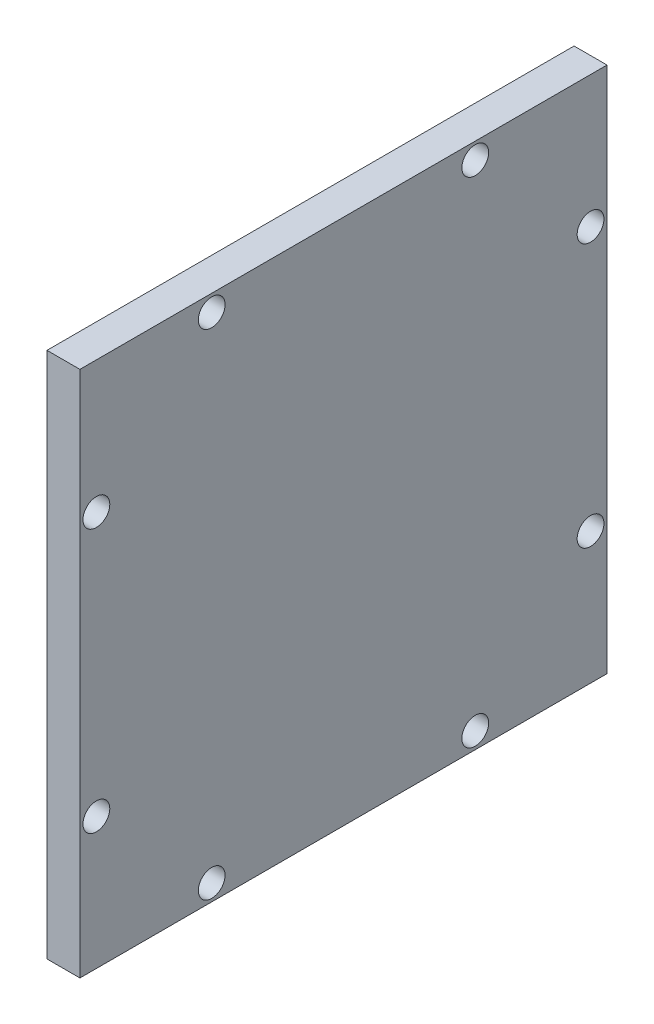
ISO-10303-21;
HEADER;
FILE_DESCRIPTION(('STEP AP214'),'2;1');
FILE_NAME('part.step','',(''),(''),'','','');
FILE_SCHEMA(('AUTOMOTIVE_DESIGN { 1 0 10303 214 1 1 1 1 }'));
ENDSEC;
DATA;
#1=APPLICATION_CONTEXT('core data for automotive mechanical design processes');
#2=APPLICATION_PROTOCOL_DEFINITION('international standard','automotive_design',2000,#1);
#3=PRODUCT_CONTEXT('',#1,'mechanical');
#4=PRODUCT('Part','Part','',(#3));
#5=PRODUCT_RELATED_PRODUCT_CATEGORY('part','',(#4));
#6=PRODUCT_DEFINITION_FORMATION('','',#4);
#7=PRODUCT_DEFINITION_CONTEXT('part definition',#1,'design');
#8=PRODUCT_DEFINITION('design','',#6,#7);
#9=PRODUCT_DEFINITION_SHAPE('','',#8);
#10=(LENGTH_UNIT() NAMED_UNIT(*) SI_UNIT(.MILLI.,.METRE.));
#11=(NAMED_UNIT(*) PLANE_ANGLE_UNIT() SI_UNIT($,.RADIAN.));
#12=(NAMED_UNIT(*) SI_UNIT($,.STERADIAN.) SOLID_ANGLE_UNIT());
#13=UNCERTAINTY_MEASURE_WITH_UNIT(LENGTH_MEASURE(1.E-05),#10,'distance_accuracy_value','');
#14=(GEOMETRIC_REPRESENTATION_CONTEXT(3) GLOBAL_UNCERTAINTY_ASSIGNED_CONTEXT((#13)) GLOBAL_UNIT_ASSIGNED_CONTEXT((#10,
#11,#12)) REPRESENTATION_CONTEXT('',''));
#15=CARTESIAN_POINT('',(0.,0.,0.));
#16=DIRECTION('',(0.,0.,1.));
#17=DIRECTION('',(1.,0.,0.));
#18=AXIS2_PLACEMENT_3D('',#15,#16,#17);
#19=CARTESIAN_POINT('',(3.,0.,0.));
#20=DIRECTION('',(0.,0.,-1.));
#21=DIRECTION('',(-1.,0.,0.));
#22=AXIS2_PLACEMENT_3D('',#19,#20,#21);
#23=PLANE('',#22);
#24=DIRECTION('',(0.,-1.,0.));
#25=VECTOR('',#24,1.);
#26=CARTESIAN_POINT('',(0.,0.,0.));
#27=LINE('',#26,#25);
#28=CARTESIAN_POINT('',(0.,48.,0.));
#29=VERTEX_POINT('',#28);
#30=CARTESIAN_POINT('',(0.,0.,0.));
#31=VERTEX_POINT('',#30);
#32=EDGE_CURVE('E107',#29,#31,#27,.T.);
#33=ORIENTED_EDGE('',*,*,#32,.T.);
#34=DIRECTION('',(-1.,0.,0.));
#35=VECTOR('',#34,1.);
#36=CARTESIAN_POINT('',(3.,0.,0.));
#37=LINE('',#36,#35);
#38=CARTESIAN_POINT('',(3.,0.,0.));
#39=VERTEX_POINT('',#38);
#40=EDGE_CURVE('E11',#39,#31,#37,.T.);
#41=ORIENTED_EDGE('',*,*,#40,.F.);
#42=DIRECTION('',(0.,-1.,0.));
#43=VECTOR('',#42,1.);
#44=CARTESIAN_POINT('',(3.,0.,0.));
#45=LINE('',#44,#43);
#46=CARTESIAN_POINT('',(3.,48.,0.));
#47=VERTEX_POINT('',#46);
#48=EDGE_CURVE('E91',#47,#39,#45,.T.);
#49=ORIENTED_EDGE('',*,*,#48,.F.);
#50=DIRECTION('',(-1.,0.,0.));
#51=VECTOR('',#50,1.);
#52=CARTESIAN_POINT('',(3.,48.,0.));
#53=LINE('',#52,#51);
#54=EDGE_CURVE('E103',#47,#29,#53,.T.);
#55=ORIENTED_EDGE('',*,*,#54,.T.);
#56=EDGE_LOOP('',(#33,#41,#49,#55));
#57=FACE_BOUND('',#56,.T.);
#58=ADVANCED_FACE('F39',(#57),#23,.F.);
#59=CARTESIAN_POINT('',(3.,0.,0.));
#60=DIRECTION('',(0.,1.,0.));
#61=DIRECTION('',(0.,0.,1.));
#62=AXIS2_PLACEMENT_3D('',#59,#60,#61);
#63=PLANE('',#62);
#64=DIRECTION('',(0.,0.,-1.));
#65=VECTOR('',#64,1.);
#66=CARTESIAN_POINT('',(0.,0.,0.));
#67=LINE('',#66,#65);
#68=CARTESIAN_POINT('',(0.,0.,-48.));
#69=VERTEX_POINT('',#68);
#70=EDGE_CURVE('E96',#31,#69,#67,.T.);
#71=ORIENTED_EDGE('',*,*,#70,.T.);
#72=DIRECTION('',(-1.,0.,0.));
#73=VECTOR('',#72,1.);
#74=CARTESIAN_POINT('',(3.,0.,-48.));
#75=LINE('',#74,#73);
#76=CARTESIAN_POINT('',(3.,0.,-48.));
#77=VERTEX_POINT('',#76);
#78=EDGE_CURVE('E48',#77,#69,#75,.T.);
#79=ORIENTED_EDGE('',*,*,#78,.F.);
#80=DIRECTION('',(0.,0.,-1.));
#81=VECTOR('',#80,1.);
#82=CARTESIAN_POINT('',(3.,0.,0.));
#83=LINE('',#82,#81);
#84=EDGE_CURVE('E86',#39,#77,#83,.T.);
#85=ORIENTED_EDGE('',*,*,#84,.F.);
#86=ORIENTED_EDGE('',*,*,#40,.T.);
#87=EDGE_LOOP('',(#71,#79,#85,#86));
#88=FACE_BOUND('',#87,.T.);
#89=ADVANCED_FACE('F95',(#88),#63,.F.);
#90=CARTESIAN_POINT('',(3.,0.,-48.));
#91=DIRECTION('',(0.,0.,1.));
#92=DIRECTION('',(1.,0.,0.));
#93=AXIS2_PLACEMENT_3D('',#90,#91,#92);
#94=PLANE('',#93);
#95=DIRECTION('',(0.,1.,0.));
#96=VECTOR('',#95,1.);
#97=CARTESIAN_POINT('',(0.,0.,-48.));
#98=LINE('',#97,#96);
#99=CARTESIAN_POINT('',(0.,48.,-48.));
#100=VERTEX_POINT('',#99);
#101=EDGE_CURVE('E73',#69,#100,#98,.T.);
#102=ORIENTED_EDGE('',*,*,#101,.T.);
#103=DIRECTION('',(-1.,0.,0.));
#104=VECTOR('',#103,1.);
#105=CARTESIAN_POINT('',(3.,48.,-48.));
#106=LINE('',#105,#104);
#107=CARTESIAN_POINT('',(3.,48.,-48.));
#108=VERTEX_POINT('',#107);
#109=EDGE_CURVE('E98',#108,#100,#106,.T.);
#110=ORIENTED_EDGE('',*,*,#109,.F.);
#111=DIRECTION('',(0.,1.,0.));
#112=VECTOR('',#111,1.);
#113=CARTESIAN_POINT('',(3.,0.,-48.));
#114=LINE('',#113,#112);
#115=EDGE_CURVE('E89',#77,#108,#114,.T.);
#116=ORIENTED_EDGE('',*,*,#115,.F.);
#117=ORIENTED_EDGE('',*,*,#78,.T.);
#118=EDGE_LOOP('',(#102,#110,#116,#117));
#119=FACE_BOUND('',#118,.T.);
#120=ADVANCED_FACE('F99',(#119),#94,.F.);
#121=CARTESIAN_POINT('',(3.,48.,0.));
#122=DIRECTION('',(0.,-1.,0.));
#123=DIRECTION('',(0.,0.,-1.));
#124=AXIS2_PLACEMENT_3D('',#121,#122,#123);
#125=PLANE('',#124);
#126=DIRECTION('',(0.,0.,1.));
#127=VECTOR('',#126,1.);
#128=CARTESIAN_POINT('',(0.,48.,0.));
#129=LINE('',#128,#127);
#130=EDGE_CURVE('E79',#100,#29,#129,.T.);
#131=ORIENTED_EDGE('',*,*,#130,.T.);
#132=ORIENTED_EDGE('',*,*,#54,.F.);
#133=DIRECTION('',(0.,0.,1.));
#134=VECTOR('',#133,1.);
#135=CARTESIAN_POINT('',(3.,48.,0.));
#136=LINE('',#135,#134);
#137=EDGE_CURVE('E56',#108,#47,#136,.T.);
#138=ORIENTED_EDGE('',*,*,#137,.F.);
#139=ORIENTED_EDGE('',*,*,#109,.T.);
#140=EDGE_LOOP('',(#131,#132,#138,#139));
#141=FACE_BOUND('',#140,.T.);
#142=ADVANCED_FACE('F121',(#141),#125,.F.);
#143=CARTESIAN_POINT('',(3.,0.,0.));
#144=DIRECTION('',(-1.,0.,0.));
#145=DIRECTION('',(0.,0.,1.));
#146=AXIS2_PLACEMENT_3D('',#143,#144,#145);
#147=PLANE('',#146);
#148=CARTESIAN_POINT('',(3.,36.,-1.5));
#149=DIRECTION('',(1.,0.,0.));
#150=DIRECTION('',(0.,0.,-1.));
#151=AXIS2_PLACEMENT_3D('',#148,#149,#150);
#152=CIRCLE('',#151,1.22);
#153=CARTESIAN_POINT('',(3.,36.,-2.72));
#154=VERTEX_POINT('',#153);
#155=EDGE_CURVE('E152',#154,#154,#152,.T.);
#156=ORIENTED_EDGE('',*,*,#155,.F.);
#157=EDGE_LOOP('',(#156));
#158=FACE_BOUND('',#157,.T.);
#159=CARTESIAN_POINT('',(3.,1.5,-36.));
#160=DIRECTION('',(1.,0.,0.));
#161=DIRECTION('',(0.,0.,-1.));
#162=AXIS2_PLACEMENT_3D('',#159,#160,#161);
#163=CIRCLE('',#162,1.22);
#164=CARTESIAN_POINT('',(3.,1.5,-37.22));
#165=VERTEX_POINT('',#164);
#166=EDGE_CURVE('E161',#165,#165,#163,.T.);
#167=ORIENTED_EDGE('',*,*,#166,.F.);
#168=EDGE_LOOP('',(#167));
#169=FACE_BOUND('',#168,.T.);
#170=CARTESIAN_POINT('',(3.,1.5,-12.));
#171=DIRECTION('',(1.,0.,0.));
#172=DIRECTION('',(0.,0.,-1.));
#173=AXIS2_PLACEMENT_3D('',#170,#171,#172);
#174=CIRCLE('',#173,1.22);
#175=CARTESIAN_POINT('',(3.,1.5,-13.22));
#176=VERTEX_POINT('',#175);
#177=EDGE_CURVE('E136',#176,#176,#174,.T.);
#178=ORIENTED_EDGE('',*,*,#177,.F.);
#179=EDGE_LOOP('',(#178));
#180=FACE_BOUND('',#179,.T.);
#181=CARTESIAN_POINT('',(3.,46.5,-36.));
#182=DIRECTION('',(1.,0.,0.));
#183=DIRECTION('',(0.,0.,-1.));
#184=AXIS2_PLACEMENT_3D('',#181,#182,#183);
#185=CIRCLE('',#184,1.22);
#186=CARTESIAN_POINT('',(3.,46.5,-37.22));
#187=VERTEX_POINT('',#186);
#188=EDGE_CURVE('E145',#187,#187,#185,.T.);
#189=ORIENTED_EDGE('',*,*,#188,.F.);
#190=EDGE_LOOP('',(#189));
#191=FACE_BOUND('',#190,.T.);
#192=CARTESIAN_POINT('',(3.,12.,-46.5));
#193=DIRECTION('',(1.,0.,0.));
#194=DIRECTION('',(0.,0.,-1.));
#195=AXIS2_PLACEMENT_3D('',#192,#193,#194);
#196=CIRCLE('',#195,1.22);
#197=CARTESIAN_POINT('',(3.,12.,-47.72));
#198=VERTEX_POINT('',#197);
#199=EDGE_CURVE('E184',#198,#198,#196,.T.);
#200=ORIENTED_EDGE('',*,*,#199,.F.);
#201=EDGE_LOOP('',(#200));
#202=FACE_BOUND('',#201,.T.);
#203=CARTESIAN_POINT('',(3.,36.,-46.5));
#204=DIRECTION('',(1.,0.,0.));
#205=DIRECTION('',(0.,0.,-1.));
#206=AXIS2_PLACEMENT_3D('',#203,#204,#205);
#207=CIRCLE('',#206,1.22);
#208=CARTESIAN_POINT('',(3.,36.,-47.72));
#209=VERTEX_POINT('',#208);
#210=EDGE_CURVE('E168',#209,#209,#207,.T.);
#211=ORIENTED_EDGE('',*,*,#210,.F.);
#212=EDGE_LOOP('',(#211));
#213=FACE_BOUND('',#212,.T.);
#214=CARTESIAN_POINT('',(3.,12.,-1.5));
#215=DIRECTION('',(1.,0.,0.));
#216=DIRECTION('',(0.,0.,-1.));
#217=AXIS2_PLACEMENT_3D('',#214,#215,#216);
#218=CIRCLE('',#217,1.22);
#219=CARTESIAN_POINT('',(3.,12.,-2.72));
#220=VERTEX_POINT('',#219);
#221=EDGE_CURVE('E177',#220,#220,#218,.T.);
#222=ORIENTED_EDGE('',*,*,#221,.F.);
#223=EDGE_LOOP('',(#222));
#224=FACE_BOUND('',#223,.T.);
#225=CARTESIAN_POINT('',(3.,46.5,-12.));
#226=DIRECTION('',(1.,0.,0.));
#227=DIRECTION('',(0.,0.,-1.));
#228=AXIS2_PLACEMENT_3D('',#225,#226,#227);
#229=CIRCLE('',#228,1.22);
#230=CARTESIAN_POINT('',(3.,46.5,-13.22));
#231=VERTEX_POINT('',#230);
#232=EDGE_CURVE('E128',#231,#231,#229,.T.);
#233=ORIENTED_EDGE('',*,*,#232,.F.);
#234=EDGE_LOOP('',(#233));
#235=FACE_BOUND('',#234,.T.);
#236=ORIENTED_EDGE('',*,*,#48,.T.);
#237=ORIENTED_EDGE('',*,*,#84,.T.);
#238=ORIENTED_EDGE('',*,*,#115,.T.);
#239=ORIENTED_EDGE('',*,*,#137,.T.);
#240=EDGE_LOOP('',(#236,#237,#238,#239));
#241=FACE_BOUND('',#240,.T.);
#242=ADVANCED_FACE('F87',(#158,#169,#180,#191,#202,#213,#224,#235,#241),#147,.F.);
#243=CARTESIAN_POINT('',(0.,0.,0.));
#244=DIRECTION('',(-1.,0.,0.));
#245=DIRECTION('',(0.,0.,1.));
#246=AXIS2_PLACEMENT_3D('',#243,#244,#245);
#247=PLANE('',#246);
#248=CARTESIAN_POINT('',(0.,36.,-1.5));
#249=DIRECTION('',(1.,0.,0.));
#250=DIRECTION('',(0.,0.,-1.));
#251=AXIS2_PLACEMENT_3D('',#248,#249,#250);
#252=CIRCLE('',#251,1.22);
#253=CARTESIAN_POINT('',(0.,36.,-2.72));
#254=VERTEX_POINT('',#253);
#255=EDGE_CURVE('E156',#254,#254,#252,.T.);
#256=ORIENTED_EDGE('',*,*,#255,.T.);
#257=EDGE_LOOP('',(#256));
#258=FACE_BOUND('',#257,.T.);
#259=CARTESIAN_POINT('',(0.,1.5,-36.));
#260=DIRECTION('',(1.,0.,0.));
#261=DIRECTION('',(0.,0.,-1.));
#262=AXIS2_PLACEMENT_3D('',#259,#260,#261);
#263=CIRCLE('',#262,1.22);
#264=CARTESIAN_POINT('',(0.,1.5,-37.22));
#265=VERTEX_POINT('',#264);
#266=EDGE_CURVE('E141',#265,#265,#263,.T.);
#267=ORIENTED_EDGE('',*,*,#266,.T.);
#268=EDGE_LOOP('',(#267));
#269=FACE_BOUND('',#268,.T.);
#270=CARTESIAN_POINT('',(0.,1.5,-12.));
#271=DIRECTION('',(1.,0.,0.));
#272=DIRECTION('',(0.,0.,-1.));
#273=AXIS2_PLACEMENT_3D('',#270,#271,#272);
#274=CIRCLE('',#273,1.22);
#275=CARTESIAN_POINT('',(0.,1.5,-13.22));
#276=VERTEX_POINT('',#275);
#277=EDGE_CURVE('E140',#276,#276,#274,.T.);
#278=ORIENTED_EDGE('',*,*,#277,.T.);
#279=EDGE_LOOP('',(#278));
#280=FACE_BOUND('',#279,.T.);
#281=CARTESIAN_POINT('',(0.,46.5,-36.));
#282=DIRECTION('',(1.,0.,0.));
#283=DIRECTION('',(0.,0.,-1.));
#284=AXIS2_PLACEMENT_3D('',#281,#282,#283);
#285=CIRCLE('',#284,1.22);
#286=CARTESIAN_POINT('',(0.,46.5,-37.22));
#287=VERTEX_POINT('',#286);
#288=EDGE_CURVE('E132',#287,#287,#285,.T.);
#289=ORIENTED_EDGE('',*,*,#288,.T.);
#290=EDGE_LOOP('',(#289));
#291=FACE_BOUND('',#290,.T.);
#292=CARTESIAN_POINT('',(0.,12.,-46.5));
#293=DIRECTION('',(1.,0.,0.));
#294=DIRECTION('',(0.,0.,-1.));
#295=AXIS2_PLACEMENT_3D('',#292,#293,#294);
#296=CIRCLE('',#295,1.22);
#297=CARTESIAN_POINT('',(0.,12.,-47.72));
#298=VERTEX_POINT('',#297);
#299=EDGE_CURVE('E173',#298,#298,#296,.T.);
#300=ORIENTED_EDGE('',*,*,#299,.T.);
#301=EDGE_LOOP('',(#300));
#302=FACE_BOUND('',#301,.T.);
#303=CARTESIAN_POINT('',(0.,36.,-46.5));
#304=DIRECTION('',(1.,0.,0.));
#305=DIRECTION('',(0.,0.,-1.));
#306=AXIS2_PLACEMENT_3D('',#303,#304,#305);
#307=CIRCLE('',#306,1.22);
#308=CARTESIAN_POINT('',(0.,36.,-47.72));
#309=VERTEX_POINT('',#308);
#310=EDGE_CURVE('E172',#309,#309,#307,.T.);
#311=ORIENTED_EDGE('',*,*,#310,.T.);
#312=EDGE_LOOP('',(#311));
#313=FACE_BOUND('',#312,.T.);
#314=CARTESIAN_POINT('',(0.,12.,-1.5));
#315=DIRECTION('',(1.,0.,0.));
#316=DIRECTION('',(0.,0.,-1.));
#317=AXIS2_PLACEMENT_3D('',#314,#315,#316);
#318=CIRCLE('',#317,1.22);
#319=CARTESIAN_POINT('',(0.,12.,-2.72));
#320=VERTEX_POINT('',#319);
#321=EDGE_CURVE('E157',#320,#320,#318,.T.);
#322=ORIENTED_EDGE('',*,*,#321,.T.);
#323=EDGE_LOOP('',(#322));
#324=FACE_BOUND('',#323,.T.);
#325=CARTESIAN_POINT('',(0.,46.5,-12.));
#326=DIRECTION('',(1.,0.,0.));
#327=DIRECTION('',(0.,0.,-1.));
#328=AXIS2_PLACEMENT_3D('',#325,#326,#327);
#329=CIRCLE('',#328,1.22);
#330=CARTESIAN_POINT('',(0.,46.5,-13.22));
#331=VERTEX_POINT('',#330);
#332=EDGE_CURVE('E111',#331,#331,#329,.T.);
#333=ORIENTED_EDGE('',*,*,#332,.T.);
#334=EDGE_LOOP('',(#333));
#335=FACE_BOUND('',#334,.T.);
#336=ORIENTED_EDGE('',*,*,#32,.F.);
#337=ORIENTED_EDGE('',*,*,#130,.F.);
#338=ORIENTED_EDGE('',*,*,#101,.F.);
#339=ORIENTED_EDGE('',*,*,#70,.F.);
#340=EDGE_LOOP('',(#336,#337,#338,#339));
#341=FACE_BOUND('',#340,.T.);
#342=ADVANCED_FACE('F124',(#258,#269,#280,#291,#302,#313,#324,#335,#341),#247,.T.);
#343=CARTESIAN_POINT('',(0.,46.5,-12.));
#344=DIRECTION('',(1.,0.,0.));
#345=DIRECTION('',(0.,0.,-1.));
#346=AXIS2_PLACEMENT_3D('',#343,#344,#345);
#347=CYLINDRICAL_SURFACE('',#346,1.22);
#348=ORIENTED_EDGE('',*,*,#332,.F.);
#349=EDGE_LOOP('',(#348));
#350=FACE_BOUND('',#349,.T.);
#351=ORIENTED_EDGE('',*,*,#232,.T.);
#352=EDGE_LOOP('',(#351));
#353=FACE_BOUND('',#352,.T.);
#354=ADVANCED_FACE('F212',(#350,#353),#347,.F.);
#355=CARTESIAN_POINT('',(0.,12.,-1.5));
#356=DIRECTION('',(1.,0.,0.));
#357=DIRECTION('',(0.,0.,-1.));
#358=AXIS2_PLACEMENT_3D('',#355,#356,#357);
#359=CYLINDRICAL_SURFACE('',#358,1.22);
#360=ORIENTED_EDGE('',*,*,#321,.F.);
#361=EDGE_LOOP('',(#360));
#362=FACE_BOUND('',#361,.T.);
#363=ORIENTED_EDGE('',*,*,#221,.T.);
#364=EDGE_LOOP('',(#363));
#365=FACE_BOUND('',#364,.T.);
#366=ADVANCED_FACE('F214',(#362,#365),#359,.F.);
#367=CARTESIAN_POINT('',(0.,36.,-46.5));
#368=DIRECTION('',(1.,0.,0.));
#369=DIRECTION('',(0.,0.,-1.));
#370=AXIS2_PLACEMENT_3D('',#367,#368,#369);
#371=CYLINDRICAL_SURFACE('',#370,1.22);
#372=ORIENTED_EDGE('',*,*,#310,.F.);
#373=EDGE_LOOP('',(#372));
#374=FACE_BOUND('',#373,.T.);
#375=ORIENTED_EDGE('',*,*,#210,.T.);
#376=EDGE_LOOP('',(#375));
#377=FACE_BOUND('',#376,.T.);
#378=ADVANCED_FACE('F198',(#374,#377),#371,.F.);
#379=CARTESIAN_POINT('',(0.,12.,-46.5));
#380=DIRECTION('',(1.,0.,0.));
#381=DIRECTION('',(0.,0.,-1.));
#382=AXIS2_PLACEMENT_3D('',#379,#380,#381);
#383=CYLINDRICAL_SURFACE('',#382,1.22);
#384=ORIENTED_EDGE('',*,*,#299,.F.);
#385=EDGE_LOOP('',(#384));
#386=FACE_BOUND('',#385,.T.);
#387=ORIENTED_EDGE('',*,*,#199,.T.);
#388=EDGE_LOOP('',(#387));
#389=FACE_BOUND('',#388,.T.);
#390=ADVANCED_FACE('F194',(#386,#389),#383,.F.);
#391=CARTESIAN_POINT('',(0.,46.5,-36.));
#392=DIRECTION('',(1.,0.,0.));
#393=DIRECTION('',(0.,0.,-1.));
#394=AXIS2_PLACEMENT_3D('',#391,#392,#393);
#395=CYLINDRICAL_SURFACE('',#394,1.22);
#396=ORIENTED_EDGE('',*,*,#288,.F.);
#397=EDGE_LOOP('',(#396));
#398=FACE_BOUND('',#397,.T.);
#399=ORIENTED_EDGE('',*,*,#188,.T.);
#400=EDGE_LOOP('',(#399));
#401=FACE_BOUND('',#400,.T.);
#402=ADVANCED_FACE('F197',(#398,#401),#395,.F.);
#403=CARTESIAN_POINT('',(0.,1.5,-12.));
#404=DIRECTION('',(1.,0.,0.));
#405=DIRECTION('',(0.,0.,-1.));
#406=AXIS2_PLACEMENT_3D('',#403,#404,#405);
#407=CYLINDRICAL_SURFACE('',#406,1.22);
#408=ORIENTED_EDGE('',*,*,#277,.F.);
#409=EDGE_LOOP('',(#408));
#410=FACE_BOUND('',#409,.T.);
#411=ORIENTED_EDGE('',*,*,#177,.T.);
#412=EDGE_LOOP('',(#411));
#413=FACE_BOUND('',#412,.T.);
#414=ADVANCED_FACE('F283',(#410,#413),#407,.F.);
#415=CARTESIAN_POINT('',(0.,1.5,-36.));
#416=DIRECTION('',(1.,0.,0.));
#417=DIRECTION('',(0.,0.,-1.));
#418=AXIS2_PLACEMENT_3D('',#415,#416,#417);
#419=CYLINDRICAL_SURFACE('',#418,1.22);
#420=ORIENTED_EDGE('',*,*,#266,.F.);
#421=EDGE_LOOP('',(#420));
#422=FACE_BOUND('',#421,.T.);
#423=ORIENTED_EDGE('',*,*,#166,.T.);
#424=EDGE_LOOP('',(#423));
#425=FACE_BOUND('',#424,.T.);
#426=ADVANCED_FACE('F293',(#422,#425),#419,.F.);
#427=CARTESIAN_POINT('',(0.,36.,-1.5));
#428=DIRECTION('',(1.,0.,0.));
#429=DIRECTION('',(0.,0.,-1.));
#430=AXIS2_PLACEMENT_3D('',#427,#428,#429);
#431=CYLINDRICAL_SURFACE('',#430,1.22);
#432=ORIENTED_EDGE('',*,*,#255,.F.);
#433=EDGE_LOOP('',(#432));
#434=FACE_BOUND('',#433,.T.);
#435=ORIENTED_EDGE('',*,*,#155,.T.);
#436=EDGE_LOOP('',(#435));
#437=FACE_BOUND('',#436,.T.);
#438=ADVANCED_FACE('F302',(#434,#437),#431,.F.);
#439=CLOSED_SHELL('',(#58,#89,#120,#142,#242,#342,#354,#366,#378,#390,#402,#414,#426,#438));
#440=MANIFOLD_SOLID_BREP('B2',#439);
#441=ADVANCED_BREP_SHAPE_REPRESENTATION('',(#18,#440),#14);
#442=SHAPE_DEFINITION_REPRESENTATION(#9,#441);
ENDSEC;
END-ISO-10303-21;
